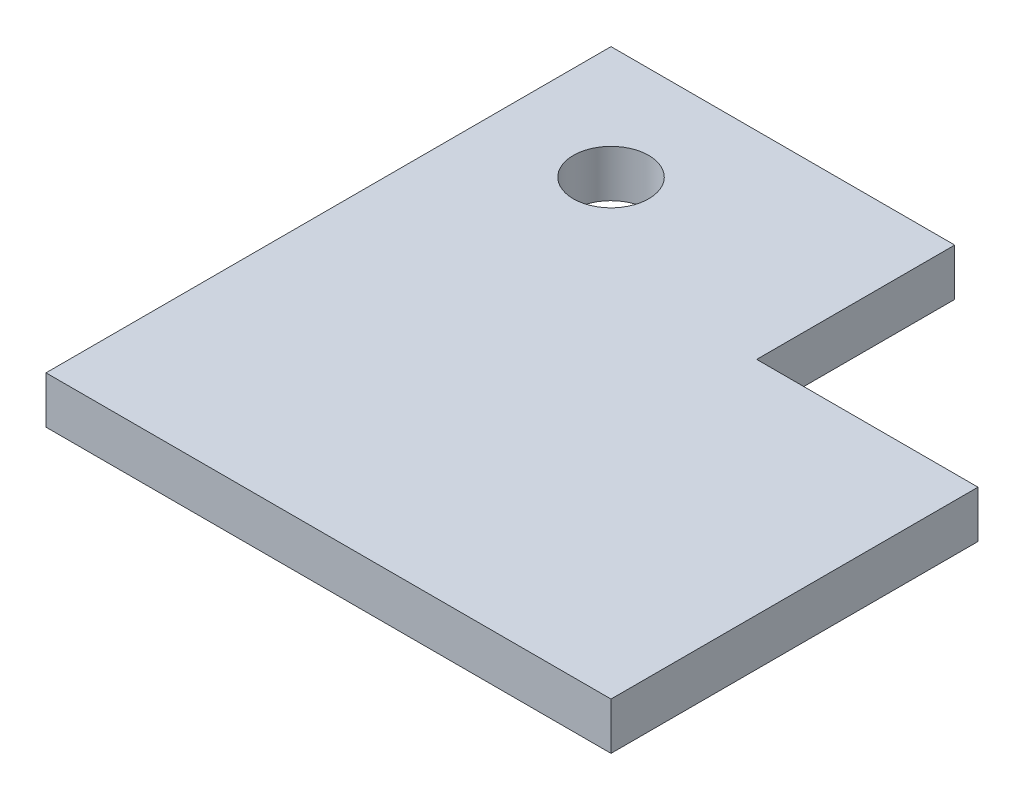
ISO-10303-21;
HEADER;
FILE_DESCRIPTION(('STEP AP214'),'2;1');
FILE_NAME('part.step','',(''),(''),'','','');
FILE_SCHEMA(('AUTOMOTIVE_DESIGN { 1 0 10303 214 1 1 1 1 }'));
ENDSEC;
DATA;
#1=APPLICATION_CONTEXT('core data for automotive mechanical design processes');
#2=APPLICATION_PROTOCOL_DEFINITION('international standard','automotive_design',2000,#1);
#3=PRODUCT_CONTEXT('',#1,'mechanical');
#4=PRODUCT('Part','Part','',(#3));
#5=PRODUCT_RELATED_PRODUCT_CATEGORY('part','',(#4));
#6=PRODUCT_DEFINITION_FORMATION('','',#4);
#7=PRODUCT_DEFINITION_CONTEXT('part definition',#1,'design');
#8=PRODUCT_DEFINITION('design','',#6,#7);
#9=PRODUCT_DEFINITION_SHAPE('','',#8);
#10=(LENGTH_UNIT() NAMED_UNIT(*) SI_UNIT(.MILLI.,.METRE.));
#11=(NAMED_UNIT(*) PLANE_ANGLE_UNIT() SI_UNIT($,.RADIAN.));
#12=(NAMED_UNIT(*) SI_UNIT($,.STERADIAN.) SOLID_ANGLE_UNIT());
#13=UNCERTAINTY_MEASURE_WITH_UNIT(LENGTH_MEASURE(1.E-05),#10,'distance_accuracy_value','');
#14=(GEOMETRIC_REPRESENTATION_CONTEXT(3) GLOBAL_UNCERTAINTY_ASSIGNED_CONTEXT((#13)) GLOBAL_UNIT_ASSIGNED_CONTEXT((#10,
#11,#12)) REPRESENTATION_CONTEXT('',''));
#15=CARTESIAN_POINT('',(0.,0.,0.));
#16=DIRECTION('',(0.,0.,1.));
#17=DIRECTION('',(1.,0.,0.));
#18=AXIS2_PLACEMENT_3D('',#15,#16,#17);
#19=CARTESIAN_POINT('',(0.,5.,0.));
#20=DIRECTION('',(0.,1.,0.));
#21=DIRECTION('',(0.,0.,1.));
#22=AXIS2_PLACEMENT_3D('',#19,#20,#21);
#23=PLANE('',#22);
#24=CARTESIAN_POINT('',(12.,5.,12.));
#25=DIRECTION('',(0.,1.,0.));
#26=DIRECTION('',(0.,0.,1.));
#27=AXIS2_PLACEMENT_3D('',#24,#25,#26);
#28=CIRCLE('',#27,4.);
#29=CARTESIAN_POINT('',(12.,5.,16.));
#30=VERTEX_POINT('',#29);
#31=EDGE_CURVE('E118',#30,#30,#28,.T.);
#32=ORIENTED_EDGE('',*,*,#31,.F.);
#33=EDGE_LOOP('',(#32));
#34=FACE_BOUND('',#33,.T.);
#35=DIRECTION('',(1.,0.,0.));
#36=VECTOR('',#35,1.);
#37=CARTESIAN_POINT('',(36.5,5.,21.03));
#38=LINE('',#37,#36);
#39=CARTESIAN_POINT('',(36.5,5.,21.03));
#40=VERTEX_POINT('',#39);
#41=CARTESIAN_POINT('',(60.,5.,21.03));
#42=VERTEX_POINT('',#41);
#43=EDGE_CURVE('E99',#40,#42,#38,.T.);
#44=ORIENTED_EDGE('',*,*,#43,.F.);
#45=DIRECTION('',(0.,0.,1.));
#46=VECTOR('',#45,1.);
#47=CARTESIAN_POINT('',(36.5,5.,0.));
#48=LINE('',#47,#46);
#49=CARTESIAN_POINT('',(36.5,5.,0.));
#50=VERTEX_POINT('',#49);
#51=EDGE_CURVE('E93',#50,#40,#48,.T.);
#52=ORIENTED_EDGE('',*,*,#51,.F.);
#53=DIRECTION('',(-1.,0.,0.));
#54=VECTOR('',#53,1.);
#55=CARTESIAN_POINT('',(0.,5.,0.));
#56=LINE('',#55,#54);
#57=CARTESIAN_POINT('',(0.,5.,0.));
#58=VERTEX_POINT('',#57);
#59=EDGE_CURVE('E57',#50,#58,#56,.T.);
#60=ORIENTED_EDGE('',*,*,#59,.T.);
#61=DIRECTION('',(0.,0.,1.));
#62=VECTOR('',#61,1.);
#63=CARTESIAN_POINT('',(0.,5.,0.));
#64=LINE('',#63,#62);
#65=CARTESIAN_POINT('',(0.,5.,60.));
#66=VERTEX_POINT('',#65);
#67=EDGE_CURVE('E124',#58,#66,#64,.T.);
#68=ORIENTED_EDGE('',*,*,#67,.T.);
#69=DIRECTION('',(1.,0.,0.));
#70=VECTOR('',#69,1.);
#71=CARTESIAN_POINT('',(0.,5.,60.));
#72=LINE('',#71,#70);
#73=CARTESIAN_POINT('',(60.,5.,60.));
#74=VERTEX_POINT('',#73);
#75=EDGE_CURVE('E79',#66,#74,#72,.T.);
#76=ORIENTED_EDGE('',*,*,#75,.T.);
#77=DIRECTION('',(0.,0.,-1.));
#78=VECTOR('',#77,1.);
#79=CARTESIAN_POINT('',(60.,5.,0.));
#80=LINE('',#79,#78);
#81=EDGE_CURVE('E111',#74,#42,#80,.T.);
#82=ORIENTED_EDGE('',*,*,#81,.T.);
#83=EDGE_LOOP('',(#44,#52,#60,#68,#76,#82));
#84=FACE_BOUND('',#83,.T.);
#85=ADVANCED_FACE('F33',(#34,#84),#23,.T.);
#86=CARTESIAN_POINT('',(0.,0.,0.));
#87=DIRECTION('',(0.,1.,0.));
#88=DIRECTION('',(0.,0.,1.));
#89=AXIS2_PLACEMENT_3D('',#86,#87,#88);
#90=PLANE('',#89);
#91=CARTESIAN_POINT('',(12.,0.,12.));
#92=DIRECTION('',(0.,1.,0.));
#93=DIRECTION('',(0.,0.,1.));
#94=AXIS2_PLACEMENT_3D('',#91,#92,#93);
#95=CIRCLE('',#94,4.);
#96=CARTESIAN_POINT('',(12.,0.,16.));
#97=VERTEX_POINT('',#96);
#98=EDGE_CURVE('E106',#97,#97,#95,.T.);
#99=ORIENTED_EDGE('',*,*,#98,.T.);
#100=EDGE_LOOP('',(#99));
#101=FACE_BOUND('',#100,.T.);
#102=DIRECTION('',(0.,0.,1.));
#103=VECTOR('',#102,1.);
#104=CARTESIAN_POINT('',(36.5,0.,0.));
#105=LINE('',#104,#103);
#106=CARTESIAN_POINT('',(36.5,0.,0.));
#107=VERTEX_POINT('',#106);
#108=CARTESIAN_POINT('',(36.5,0.,21.03));
#109=VERTEX_POINT('',#108);
#110=EDGE_CURVE('E48',#107,#109,#105,.T.);
#111=ORIENTED_EDGE('',*,*,#110,.T.);
#112=DIRECTION('',(1.,0.,0.));
#113=VECTOR('',#112,1.);
#114=CARTESIAN_POINT('',(36.5,0.,21.03));
#115=LINE('',#114,#113);
#116=CARTESIAN_POINT('',(60.,0.,21.03));
#117=VERTEX_POINT('',#116);
#118=EDGE_CURVE('E100',#109,#117,#115,.T.);
#119=ORIENTED_EDGE('',*,*,#118,.T.);
#120=DIRECTION('',(0.,0.,-1.));
#121=VECTOR('',#120,1.);
#122=CARTESIAN_POINT('',(60.,0.,0.));
#123=LINE('',#122,#121);
#124=CARTESIAN_POINT('',(60.,0.,60.));
#125=VERTEX_POINT('',#124);
#126=EDGE_CURVE('E134',#125,#117,#123,.T.);
#127=ORIENTED_EDGE('',*,*,#126,.F.);
#128=DIRECTION('',(1.,0.,0.));
#129=VECTOR('',#128,1.);
#130=CARTESIAN_POINT('',(0.,0.,60.));
#131=LINE('',#130,#129);
#132=CARTESIAN_POINT('',(0.,0.,60.));
#133=VERTEX_POINT('',#132);
#134=EDGE_CURVE('E132',#133,#125,#131,.T.);
#135=ORIENTED_EDGE('',*,*,#134,.F.);
#136=DIRECTION('',(0.,0.,1.));
#137=VECTOR('',#136,1.);
#138=CARTESIAN_POINT('',(0.,0.,0.));
#139=LINE('',#138,#137);
#140=CARTESIAN_POINT('',(0.,0.,0.));
#141=VERTEX_POINT('',#140);
#142=EDGE_CURVE('E121',#141,#133,#139,.T.);
#143=ORIENTED_EDGE('',*,*,#142,.F.);
#144=DIRECTION('',(-1.,0.,0.));
#145=VECTOR('',#144,1.);
#146=CARTESIAN_POINT('',(0.,0.,0.));
#147=LINE('',#146,#145);
#148=EDGE_CURVE('E74',#107,#141,#147,.T.);
#149=ORIENTED_EDGE('',*,*,#148,.F.);
#150=EDGE_LOOP('',(#111,#119,#127,#135,#143,#149));
#151=FACE_BOUND('',#150,.T.);
#152=ADVANCED_FACE('F143',(#101,#151),#90,.F.);
#153=CARTESIAN_POINT('',(60.,5.,0.));
#154=DIRECTION('',(-1.,0.,0.));
#155=DIRECTION('',(0.,0.,1.));
#156=AXIS2_PLACEMENT_3D('',#153,#154,#155);
#157=PLANE('',#156);
#158=DIRECTION('',(0.,-1.,0.));
#159=VECTOR('',#158,1.);
#160=CARTESIAN_POINT('',(60.,5.,21.03));
#161=LINE('',#160,#159);
#162=EDGE_CURVE('E107',#42,#117,#161,.T.);
#163=ORIENTED_EDGE('',*,*,#162,.F.);
#164=ORIENTED_EDGE('',*,*,#81,.F.);
#165=DIRECTION('',(0.,-1.,0.));
#166=VECTOR('',#165,1.);
#167=CARTESIAN_POINT('',(60.,5.,60.));
#168=LINE('',#167,#166);
#169=EDGE_CURVE('E41',#74,#125,#168,.T.);
#170=ORIENTED_EDGE('',*,*,#169,.T.);
#171=ORIENTED_EDGE('',*,*,#126,.T.);
#172=EDGE_LOOP('',(#163,#164,#170,#171));
#173=FACE_BOUND('',#172,.T.);
#174=ADVANCED_FACE('F141',(#173),#157,.F.);
#175=CARTESIAN_POINT('',(0.,5.,0.));
#176=DIRECTION('',(0.,0.,1.));
#177=DIRECTION('',(1.,0.,0.));
#178=AXIS2_PLACEMENT_3D('',#175,#176,#177);
#179=PLANE('',#178);
#180=DIRECTION('',(0.,-1.,0.));
#181=VECTOR('',#180,1.);
#182=CARTESIAN_POINT('',(36.5,5.,0.));
#183=LINE('',#182,#181);
#184=EDGE_CURVE('E97',#50,#107,#183,.T.);
#185=ORIENTED_EDGE('',*,*,#184,.T.);
#186=ORIENTED_EDGE('',*,*,#148,.T.);
#187=DIRECTION('',(0.,-1.,0.));
#188=VECTOR('',#187,1.);
#189=CARTESIAN_POINT('',(0.,5.,0.));
#190=LINE('',#189,#188);
#191=EDGE_CURVE('E129',#58,#141,#190,.T.);
#192=ORIENTED_EDGE('',*,*,#191,.F.);
#193=ORIENTED_EDGE('',*,*,#59,.F.);
#194=EDGE_LOOP('',(#185,#186,#192,#193));
#195=FACE_BOUND('',#194,.T.);
#196=ADVANCED_FACE('F148',(#195),#179,.F.);
#197=CARTESIAN_POINT('',(0.,5.,0.));
#198=DIRECTION('',(1.,0.,0.));
#199=DIRECTION('',(0.,0.,-1.));
#200=AXIS2_PLACEMENT_3D('',#197,#198,#199);
#201=PLANE('',#200);
#202=ORIENTED_EDGE('',*,*,#142,.T.);
#203=DIRECTION('',(0.,-1.,0.));
#204=VECTOR('',#203,1.);
#205=CARTESIAN_POINT('',(0.,5.,60.));
#206=LINE('',#205,#204);
#207=EDGE_CURVE('E11',#66,#133,#206,.T.);
#208=ORIENTED_EDGE('',*,*,#207,.F.);
#209=ORIENTED_EDGE('',*,*,#67,.F.);
#210=ORIENTED_EDGE('',*,*,#191,.T.);
#211=EDGE_LOOP('',(#202,#208,#209,#210));
#212=FACE_BOUND('',#211,.T.);
#213=ADVANCED_FACE('F35',(#212),#201,.F.);
#214=CARTESIAN_POINT('',(0.,5.,60.));
#215=DIRECTION('',(0.,0.,-1.));
#216=DIRECTION('',(-1.,0.,0.));
#217=AXIS2_PLACEMENT_3D('',#214,#215,#216);
#218=PLANE('',#217);
#219=ORIENTED_EDGE('',*,*,#134,.T.);
#220=ORIENTED_EDGE('',*,*,#169,.F.);
#221=ORIENTED_EDGE('',*,*,#75,.F.);
#222=ORIENTED_EDGE('',*,*,#207,.T.);
#223=EDGE_LOOP('',(#219,#220,#221,#222));
#224=FACE_BOUND('',#223,.T.);
#225=ADVANCED_FACE('F156',(#224),#218,.F.);
#226=CARTESIAN_POINT('',(12.,5.,12.));
#227=DIRECTION('',(0.,-1.,0.));
#228=DIRECTION('',(0.,0.,-1.));
#229=AXIS2_PLACEMENT_3D('',#226,#227,#228);
#230=CYLINDRICAL_SURFACE('',#229,4.);
#231=ORIENTED_EDGE('',*,*,#31,.T.);
#232=EDGE_LOOP('',(#231));
#233=FACE_BOUND('',#232,.T.);
#234=ORIENTED_EDGE('',*,*,#98,.F.);
#235=EDGE_LOOP('',(#234));
#236=FACE_BOUND('',#235,.T.);
#237=ADVANCED_FACE('F169',(#233,#236),#230,.F.);
#238=CARTESIAN_POINT('',(36.5,5.,0.));
#239=DIRECTION('',(1.,0.,0.));
#240=DIRECTION('',(0.,0.,-1.));
#241=AXIS2_PLACEMENT_3D('',#238,#239,#240);
#242=PLANE('',#241);
#243=ORIENTED_EDGE('',*,*,#110,.F.);
#244=ORIENTED_EDGE('',*,*,#184,.F.);
#245=ORIENTED_EDGE('',*,*,#51,.T.);
#246=DIRECTION('',(0.,-1.,0.));
#247=VECTOR('',#246,1.);
#248=CARTESIAN_POINT('',(36.5,5.,21.03));
#249=LINE('',#248,#247);
#250=EDGE_CURVE('E96',#40,#109,#249,.T.);
#251=ORIENTED_EDGE('',*,*,#250,.T.);
#252=EDGE_LOOP('',(#243,#244,#245,#251));
#253=FACE_BOUND('',#252,.T.);
#254=ADVANCED_FACE('F95',(#253),#242,.T.);
#255=CARTESIAN_POINT('',(36.5,5.,21.03));
#256=DIRECTION('',(0.,0.,-1.));
#257=DIRECTION('',(-1.,0.,0.));
#258=AXIS2_PLACEMENT_3D('',#255,#256,#257);
#259=PLANE('',#258);
#260=ORIENTED_EDGE('',*,*,#118,.F.);
#261=ORIENTED_EDGE('',*,*,#250,.F.);
#262=ORIENTED_EDGE('',*,*,#43,.T.);
#263=ORIENTED_EDGE('',*,*,#162,.T.);
#264=EDGE_LOOP('',(#260,#261,#262,#263));
#265=FACE_BOUND('',#264,.T.);
#266=ADVANCED_FACE('F103',(#265),#259,.T.);
#267=CLOSED_SHELL('',(#85,#152,#174,#196,#213,#225,#237,#254,#266));
#268=MANIFOLD_SOLID_BREP('B2',#267);
#269=ADVANCED_BREP_SHAPE_REPRESENTATION('',(#18,#268),#14);
#270=SHAPE_DEFINITION_REPRESENTATION(#9,#269);
ENDSEC;
END-ISO-10303-21;
